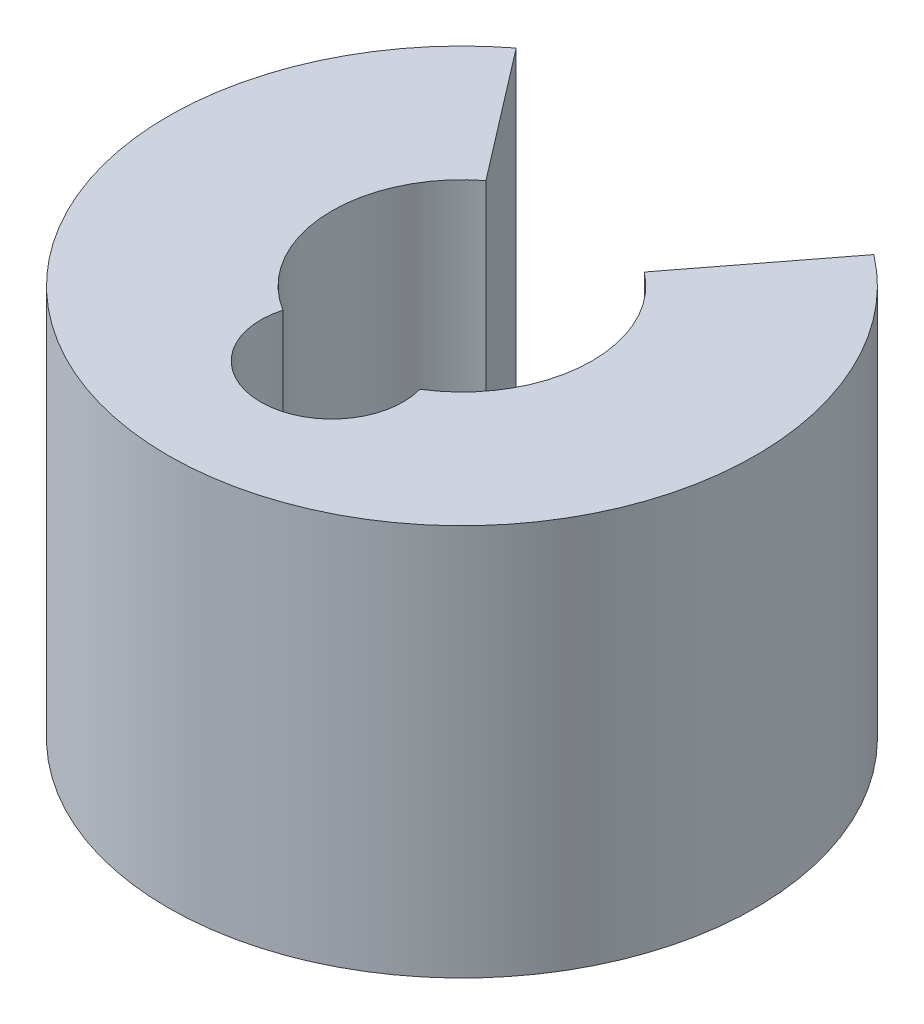
ISO-10303-21;
HEADER;
FILE_DESCRIPTION(('STEP AP214'),'2;1');
FILE_NAME('part.step','',(''),(''),'','','');
FILE_SCHEMA(('AUTOMOTIVE_DESIGN { 1 0 10303 214 1 1 1 1 }'));
ENDSEC;
DATA;
#1=APPLICATION_CONTEXT('core data for automotive mechanical design processes');
#2=APPLICATION_PROTOCOL_DEFINITION('international standard','automotive_design',2000,#1);
#3=PRODUCT_CONTEXT('',#1,'mechanical');
#4=PRODUCT('Part','Part','',(#3));
#5=PRODUCT_RELATED_PRODUCT_CATEGORY('part','',(#4));
#6=PRODUCT_DEFINITION_FORMATION('','',#4);
#7=PRODUCT_DEFINITION_CONTEXT('part definition',#1,'design');
#8=PRODUCT_DEFINITION('design','',#6,#7);
#9=PRODUCT_DEFINITION_SHAPE('','',#8);
#10=(LENGTH_UNIT() NAMED_UNIT(*) SI_UNIT(.MILLI.,.METRE.));
#11=(NAMED_UNIT(*) PLANE_ANGLE_UNIT() SI_UNIT($,.RADIAN.));
#12=(NAMED_UNIT(*) SI_UNIT($,.STERADIAN.) SOLID_ANGLE_UNIT());
#13=UNCERTAINTY_MEASURE_WITH_UNIT(LENGTH_MEASURE(1.E-05),#10,'distance_accuracy_value','');
#14=(GEOMETRIC_REPRESENTATION_CONTEXT(3) GLOBAL_UNCERTAINTY_ASSIGNED_CONTEXT((#13)) GLOBAL_UNIT_ASSIGNED_CONTEXT((#10,
#11,#12)) REPRESENTATION_CONTEXT('',''));
#15=CARTESIAN_POINT('',(0.,0.,0.));
#16=DIRECTION('',(0.,0.,1.));
#17=DIRECTION('',(1.,0.,0.));
#18=AXIS2_PLACEMENT_3D('',#15,#16,#17);
#19=CARTESIAN_POINT('',(0.,3.175,2.1082));
#20=DIRECTION('',(0.,-1.,0.));
#21=DIRECTION('',(0.,0.,-1.));
#22=AXIS2_PLACEMENT_3D('',#19,#20,#21);
#23=CYLINDRICAL_SURFACE('',#22,1.1543);
#24=DIRECTION('',(0.,1.,0.));
#25=VECTOR('',#24,1.);
#26=CARTESIAN_POINT('',(-1.11020204436313,0.,1.7921938122569));
#27=LINE('',#26,#25);
#28=CARTESIAN_POINT('',(-1.11020204436313,-3.175,1.7921938122569));
#29=VERTEX_POINT('',#28);
#30=CARTESIAN_POINT('',(-1.11020204436313,3.175,1.7921938122569));
#31=VERTEX_POINT('',#30);
#32=EDGE_CURVE('E130',#29,#31,#27,.T.);
#33=ORIENTED_EDGE('',*,*,#32,.T.);
#34=CARTESIAN_POINT('',(0.,3.175,2.1082));
#35=DIRECTION('',(0.,-1.,0.));
#36=DIRECTION('',(0.,0.,-1.));
#37=AXIS2_PLACEMENT_3D('',#34,#35,#36);
#38=CIRCLE('',#37,1.1543);
#39=CARTESIAN_POINT('',(1.11020204436313,3.175,1.7921938122569));
#40=VERTEX_POINT('',#39);
#41=EDGE_CURVE('E127',#40,#31,#38,.T.);
#42=ORIENTED_EDGE('',*,*,#41,.F.);
#43=DIRECTION('',(0.,-1.,0.));
#44=VECTOR('',#43,1.);
#45=CARTESIAN_POINT('',(1.11020204436313,0.,1.7921938122569));
#46=LINE('',#45,#44);
#47=CARTESIAN_POINT('',(1.11020204436313,-3.175,1.7921938122569));
#48=VERTEX_POINT('',#47);
#49=EDGE_CURVE('E27',#40,#48,#46,.T.);
#50=ORIENTED_EDGE('',*,*,#49,.T.);
#51=CARTESIAN_POINT('',(0.,-3.175,2.1082));
#52=DIRECTION('',(0.,-1.,0.));
#53=DIRECTION('',(0.,0.,-1.));
#54=AXIS2_PLACEMENT_3D('',#51,#52,#53);
#55=CIRCLE('',#54,1.1543);
#56=EDGE_CURVE('E102',#48,#29,#55,.T.);
#57=ORIENTED_EDGE('',*,*,#56,.T.);
#58=EDGE_LOOP('',(#33,#42,#50,#57));
#59=FACE_BOUND('',#58,.T.);
#60=ADVANCED_FACE('F16',(#59),#23,.F.);
#61=CARTESIAN_POINT('',(0.,3.175,0.));
#62=DIRECTION('',(-0.793353340291235,0.,0.608761429008721));
#63=DIRECTION('',(0.,1.,0.));
#64=AXIS2_PLACEMENT_3D('',#61,#62,#63);
#65=PLANE('',#64);
#66=DIRECTION('',(0.,-1.,0.));
#67=VECTOR('',#66,1.);
#68=CARTESIAN_POINT('',(-1.28339084463619,3.175,-1.67254751200198));
#69=LINE('',#68,#67);
#70=CARTESIAN_POINT('',(-1.28339084463619,3.175,-1.67254751200198));
#71=VERTEX_POINT('',#70);
#72=CARTESIAN_POINT('',(-1.28339084463619,-3.175,-1.67254751200198));
#73=VERTEX_POINT('',#72);
#74=EDGE_CURVE('E122',#71,#73,#69,.T.);
#75=ORIENTED_EDGE('',*,*,#74,.T.);
#76=DIRECTION('',(-0.608761429008721,0.,-0.793353340291235));
#77=VECTOR('',#76,1.);
#78=CARTESIAN_POINT('',(0.,-3.175,0.));
#79=LINE('',#78,#77);
#80=CARTESIAN_POINT('',(-2.89922630565404,-3.175,-3.778345283137));
#81=VERTEX_POINT('',#80);
#82=EDGE_CURVE('E156',#73,#81,#79,.T.);
#83=ORIENTED_EDGE('',*,*,#82,.T.);
#84=DIRECTION('',(0.,-1.,0.));
#85=VECTOR('',#84,1.);
#86=CARTESIAN_POINT('',(-2.89922630565404,3.175,-3.778345283137));
#87=LINE('',#86,#85);
#88=CARTESIAN_POINT('',(-2.89922630565404,3.175,-3.778345283137));
#89=VERTEX_POINT('',#88);
#90=EDGE_CURVE('E37',#89,#81,#87,.T.);
#91=ORIENTED_EDGE('',*,*,#90,.F.);
#92=DIRECTION('',(-0.608761429008721,0.,-0.793353340291235));
#93=VECTOR('',#92,1.);
#94=CARTESIAN_POINT('',(0.,3.175,0.));
#95=LINE('',#94,#93);
#96=EDGE_CURVE('E113',#71,#89,#95,.T.);
#97=ORIENTED_EDGE('',*,*,#96,.F.);
#98=EDGE_LOOP('',(#75,#83,#91,#97));
#99=FACE_BOUND('',#98,.T.);
#100=ADVANCED_FACE('F258',(#99),#65,.F.);
#101=CARTESIAN_POINT('',(0.,3.175,0.));
#102=DIRECTION('',(-0.793353340291234,0.,-0.608761429008723));
#103=DIRECTION('',(-0.608761429008723,0.,0.793353340291234));
#104=AXIS2_PLACEMENT_3D('',#101,#102,#103);
#105=PLANE('',#104);
#106=DIRECTION('',(0.608761429008722,0.,-0.793353340291234));
#107=VECTOR('',#106,1.);
#108=CARTESIAN_POINT('',(0.,3.175,0.));
#109=LINE('',#108,#107);
#110=CARTESIAN_POINT('',(1.28339084463619,3.175,-1.67254751200198));
#111=VERTEX_POINT('',#110);
#112=CARTESIAN_POINT('',(2.89922630565404,3.175,-3.778345283137));
#113=VERTEX_POINT('',#112);
#114=EDGE_CURVE('E94',#111,#113,#109,.T.);
#115=ORIENTED_EDGE('',*,*,#114,.T.);
#116=DIRECTION('',(0.,-1.,0.));
#117=VECTOR('',#116,1.);
#118=CARTESIAN_POINT('',(2.89922630565404,3.175,-3.778345283137));
#119=LINE('',#118,#117);
#120=CARTESIAN_POINT('',(2.89922630565404,-3.175,-3.778345283137));
#121=VERTEX_POINT('',#120);
#122=EDGE_CURVE('E118',#113,#121,#119,.T.);
#123=ORIENTED_EDGE('',*,*,#122,.T.);
#124=DIRECTION('',(0.608761429008722,0.,-0.793353340291234));
#125=VECTOR('',#124,1.);
#126=CARTESIAN_POINT('',(0.,-3.175,0.));
#127=LINE('',#126,#125);
#128=CARTESIAN_POINT('',(1.28339084463619,-3.175,-1.67254751200198));
#129=VERTEX_POINT('',#128);
#130=EDGE_CURVE('E100',#129,#121,#127,.T.);
#131=ORIENTED_EDGE('',*,*,#130,.F.);
#132=DIRECTION('',(0.,-1.,0.));
#133=VECTOR('',#132,1.);
#134=CARTESIAN_POINT('',(1.28339084463619,3.175,-1.67254751200198));
#135=LINE('',#134,#133);
#136=EDGE_CURVE('E10',#111,#129,#135,.T.);
#137=ORIENTED_EDGE('',*,*,#136,.F.);
#138=EDGE_LOOP('',(#115,#123,#131,#137));
#139=FACE_BOUND('',#138,.T.);
#140=ADVANCED_FACE('F95',(#139),#105,.T.);
#141=CARTESIAN_POINT('',(0.,3.175,0.));
#142=DIRECTION('',(0.,-1.,0.));
#143=DIRECTION('',(0.,0.,-1.));
#144=AXIS2_PLACEMENT_3D('',#141,#142,#143);
#145=CYLINDRICAL_SURFACE('',#144,2.1082);
#146=ORIENTED_EDGE('',*,*,#49,.F.);
#147=CARTESIAN_POINT('',(0.,3.175,0.));
#148=DIRECTION('',(0.,1.,0.));
#149=DIRECTION('',(0.,0.,1.));
#150=AXIS2_PLACEMENT_3D('',#147,#148,#149);
#151=CIRCLE('',#150,2.1082);
#152=EDGE_CURVE('E19',#40,#111,#151,.T.);
#153=ORIENTED_EDGE('',*,*,#152,.T.);
#154=ORIENTED_EDGE('',*,*,#136,.T.);
#155=CARTESIAN_POINT('',(0.,-3.175,0.));
#156=DIRECTION('',(0.,1.,0.));
#157=DIRECTION('',(0.,0.,1.));
#158=AXIS2_PLACEMENT_3D('',#155,#156,#157);
#159=CIRCLE('',#158,2.1082);
#160=EDGE_CURVE('E151',#48,#129,#159,.T.);
#161=ORIENTED_EDGE('',*,*,#160,.F.);
#162=EDGE_LOOP('',(#146,#153,#154,#161));
#163=FACE_BOUND('',#162,.T.);
#164=ADVANCED_FACE('F97',(#163),#145,.F.);
#165=CARTESIAN_POINT('',(0.,3.175,0.));
#166=DIRECTION('',(0.,-1.,0.));
#167=DIRECTION('',(0.,0.,-1.));
#168=AXIS2_PLACEMENT_3D('',#165,#166,#167);
#169=CYLINDRICAL_SURFACE('',#168,4.7625);
#170=CARTESIAN_POINT('',(0.,3.175,0.));
#171=DIRECTION('',(0.,1.,0.));
#172=DIRECTION('',(0.,0.,1.));
#173=AXIS2_PLACEMENT_3D('',#170,#171,#172);
#174=CIRCLE('',#173,4.7625);
#175=EDGE_CURVE('E110',#89,#113,#174,.T.);
#176=ORIENTED_EDGE('',*,*,#175,.F.);
#177=ORIENTED_EDGE('',*,*,#90,.T.);
#178=CARTESIAN_POINT('',(0.,-3.175,0.));
#179=DIRECTION('',(0.,1.,0.));
#180=DIRECTION('',(0.,0.,1.));
#181=AXIS2_PLACEMENT_3D('',#178,#179,#180);
#182=CIRCLE('',#181,4.7625);
#183=EDGE_CURVE('E147',#81,#121,#182,.T.);
#184=ORIENTED_EDGE('',*,*,#183,.T.);
#185=ORIENTED_EDGE('',*,*,#122,.F.);
#186=EDGE_LOOP('',(#176,#177,#184,#185));
#187=FACE_BOUND('',#186,.T.);
#188=ADVANCED_FACE('F268',(#187),#169,.T.);
#189=CARTESIAN_POINT('',(0.,-3.175,0.));
#190=DIRECTION('',(0.,1.,0.));
#191=DIRECTION('',(1.,0.,0.));
#192=AXIS2_PLACEMENT_3D('',#189,#190,#191);
#193=PLANE('',#192);
#194=CARTESIAN_POINT('',(0.,-3.175,0.));
#195=DIRECTION('',(0.,1.,0.));
#196=DIRECTION('',(0.,0.,1.));
#197=AXIS2_PLACEMENT_3D('',#194,#195,#196);
#198=CIRCLE('',#197,2.1082);
#199=EDGE_CURVE('E123',#73,#29,#198,.T.);
#200=ORIENTED_EDGE('',*,*,#199,.T.);
#201=ORIENTED_EDGE('',*,*,#56,.F.);
#202=ORIENTED_EDGE('',*,*,#160,.T.);
#203=ORIENTED_EDGE('',*,*,#130,.T.);
#204=ORIENTED_EDGE('',*,*,#183,.F.);
#205=ORIENTED_EDGE('',*,*,#82,.F.);
#206=EDGE_LOOP('',(#200,#201,#202,#203,#204,#205));
#207=FACE_BOUND('',#206,.T.);
#208=ADVANCED_FACE('F172',(#207),#193,.F.);
#209=CARTESIAN_POINT('',(0.,3.175,0.));
#210=DIRECTION('',(0.,1.,0.));
#211=DIRECTION('',(1.,0.,0.));
#212=AXIS2_PLACEMENT_3D('',#209,#210,#211);
#213=PLANE('',#212);
#214=ORIENTED_EDGE('',*,*,#41,.T.);
#215=CARTESIAN_POINT('',(0.,3.175,0.));
#216=DIRECTION('',(0.,1.,0.));
#217=DIRECTION('',(0.,0.,1.));
#218=AXIS2_PLACEMENT_3D('',#215,#216,#217);
#219=CIRCLE('',#218,2.1082);
#220=EDGE_CURVE('E121',#71,#31,#219,.T.);
#221=ORIENTED_EDGE('',*,*,#220,.F.);
#222=ORIENTED_EDGE('',*,*,#96,.T.);
#223=ORIENTED_EDGE('',*,*,#175,.T.);
#224=ORIENTED_EDGE('',*,*,#114,.F.);
#225=ORIENTED_EDGE('',*,*,#152,.F.);
#226=EDGE_LOOP('',(#214,#221,#222,#223,#224,#225));
#227=FACE_BOUND('',#226,.T.);
#228=ADVANCED_FACE('F104',(#227),#213,.T.);
#229=CARTESIAN_POINT('',(0.,3.175,0.));
#230=DIRECTION('',(0.,-1.,0.));
#231=DIRECTION('',(0.,0.,-1.));
#232=AXIS2_PLACEMENT_3D('',#229,#230,#231);
#233=CYLINDRICAL_SURFACE('',#232,2.1082);
#234=ORIENTED_EDGE('',*,*,#32,.F.);
#235=ORIENTED_EDGE('',*,*,#199,.F.);
#236=ORIENTED_EDGE('',*,*,#74,.F.);
#237=ORIENTED_EDGE('',*,*,#220,.T.);
#238=EDGE_LOOP('',(#234,#235,#236,#237));
#239=FACE_BOUND('',#238,.T.);
#240=ADVANCED_FACE('F262',(#239),#233,.F.);
#241=CLOSED_SHELL('',(#60,#100,#140,#164,#188,#208,#228,#240));
#242=MANIFOLD_SOLID_BREP('B1',#241);
#243=ADVANCED_BREP_SHAPE_REPRESENTATION('',(#18,#242),#14);
#244=SHAPE_DEFINITION_REPRESENTATION(#9,#243);
ENDSEC;
END-ISO-10303-21;
